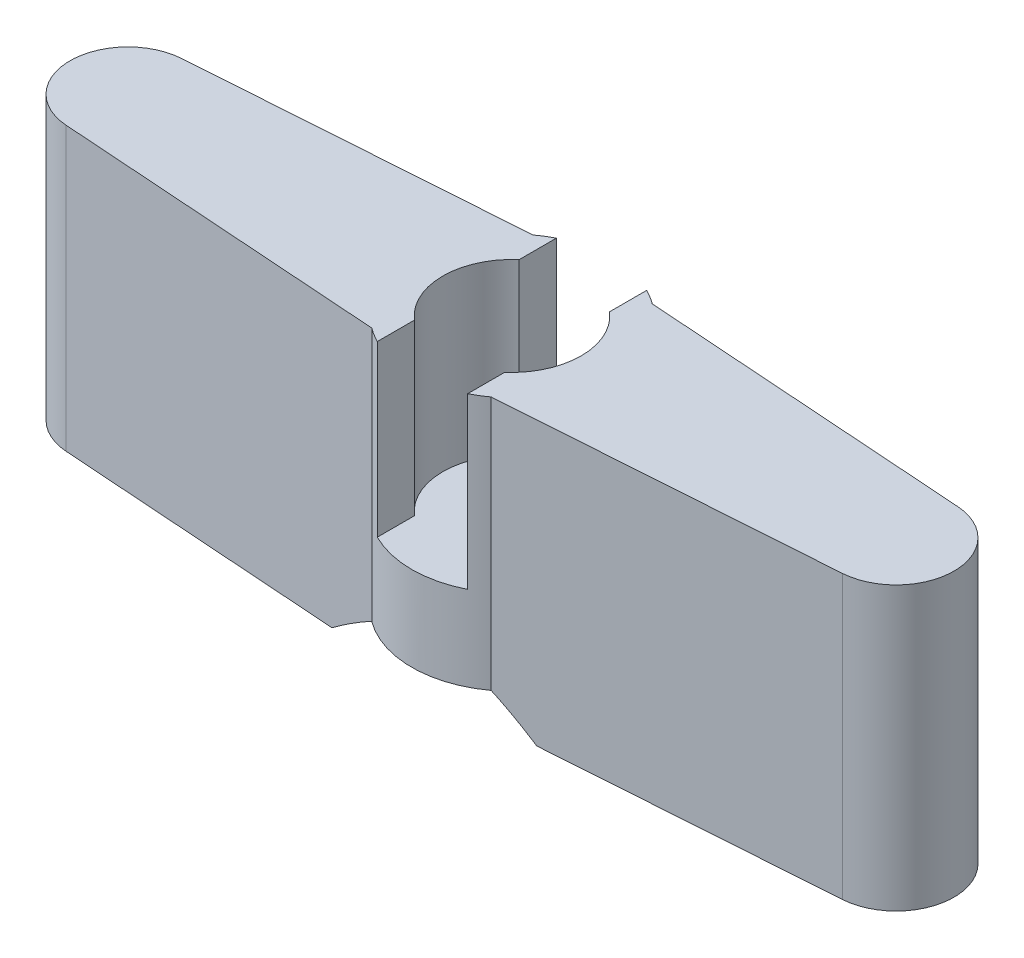
ISO-10303-21;
HEADER;
FILE_DESCRIPTION(('STEP AP214'),'2;1');
FILE_NAME('part.step','',(''),(''),'','','');
FILE_SCHEMA(('AUTOMOTIVE_DESIGN { 1 0 10303 214 1 1 1 1 }'));
ENDSEC;
DATA;
#1=APPLICATION_CONTEXT('core data for automotive mechanical design processes');
#2=APPLICATION_PROTOCOL_DEFINITION('international standard','automotive_design',2000,#1);
#3=PRODUCT_CONTEXT('',#1,'mechanical');
#4=PRODUCT('Part','Part','',(#3));
#5=PRODUCT_RELATED_PRODUCT_CATEGORY('part','',(#4));
#6=PRODUCT_DEFINITION_FORMATION('','',#4);
#7=PRODUCT_DEFINITION_CONTEXT('part definition',#1,'design');
#8=PRODUCT_DEFINITION('design','',#6,#7);
#9=PRODUCT_DEFINITION_SHAPE('','',#8);
#10=(LENGTH_UNIT() NAMED_UNIT(*) SI_UNIT(.MILLI.,.METRE.));
#11=(NAMED_UNIT(*) PLANE_ANGLE_UNIT() SI_UNIT($,.RADIAN.));
#12=(NAMED_UNIT(*) SI_UNIT($,.STERADIAN.) SOLID_ANGLE_UNIT());
#13=UNCERTAINTY_MEASURE_WITH_UNIT(LENGTH_MEASURE(1.E-05),#10,'distance_accuracy_value','');
#14=(GEOMETRIC_REPRESENTATION_CONTEXT(3) GLOBAL_UNCERTAINTY_ASSIGNED_CONTEXT((#13)) GLOBAL_UNIT_ASSIGNED_CONTEXT((#10,
#11,#12)) REPRESENTATION_CONTEXT('',''));
#15=CARTESIAN_POINT('',(0.,0.,0.));
#16=DIRECTION('',(0.,0.,1.));
#17=DIRECTION('',(1.,0.,0.));
#18=AXIS2_PLACEMENT_3D('',#15,#16,#17);
#19=CARTESIAN_POINT('',(-13.6,10.,0.));
#20=DIRECTION('',(0.,-1.,0.));
#21=DIRECTION('',(0.,0.,-1.));
#22=AXIS2_PLACEMENT_3D('',#19,#20,#21);
#23=PLANE('',#22);
#24=CARTESIAN_POINT('',(0.,10.,0.));
#25=DIRECTION('',(0.,1.,0.));
#26=DIRECTION('',(0.,0.,1.));
#27=AXIS2_PLACEMENT_3D('',#24,#25,#26);
#28=CIRCLE('',#27,3.55);
#29=CARTESIAN_POINT('',(-2.11206720067856,10.,2.85336155084101));
#30=VERTEX_POINT('',#29);
#31=CARTESIAN_POINT('',(-1.6,10.,3.16899037549817));
#32=VERTEX_POINT('',#31);
#33=EDGE_CURVE('E267',#30,#32,#28,.T.);
#34=ORIENTED_EDGE('',*,*,#33,.T.);
#35=DIRECTION('',(0.,0.,1.));
#36=VECTOR('',#35,1.);
#37=CARTESIAN_POINT('',(-1.6,10.,5.45));
#38=LINE('',#37,#36);
#39=CARTESIAN_POINT('',(-1.6,10.,1.85539753152795));
#40=VERTEX_POINT('',#39);
#41=EDGE_CURVE('E199',#40,#32,#38,.T.);
#42=ORIENTED_EDGE('',*,*,#41,.F.);
#43=CARTESIAN_POINT('',(0.,10.,0.));
#44=DIRECTION('',(0.,1.,0.));
#45=DIRECTION('',(0.,0.,1.));
#46=AXIS2_PLACEMENT_3D('',#43,#44,#45);
#47=CIRCLE('',#46,2.45);
#48=CARTESIAN_POINT('',(-1.6,10.,-1.85539753152795));
#49=VERTEX_POINT('',#48);
#50=EDGE_CURVE('E202',#49,#40,#47,.T.);
#51=ORIENTED_EDGE('',*,*,#50,.F.);
#52=DIRECTION('',(0.,0.,-1.));
#53=VECTOR('',#52,1.);
#54=CARTESIAN_POINT('',(-1.6,10.,0.));
#55=LINE('',#54,#53);
#56=CARTESIAN_POINT('',(-1.6,10.,-3.16899037549816));
#57=VERTEX_POINT('',#56);
#58=EDGE_CURVE('E58',#49,#57,#55,.T.);
#59=ORIENTED_EDGE('',*,*,#58,.T.);
#60=CARTESIAN_POINT('',(0.,10.,0.));
#61=DIRECTION('',(0.,1.,0.));
#62=DIRECTION('',(0.,0.,1.));
#63=AXIS2_PLACEMENT_3D('',#60,#61,#62);
#64=CIRCLE('',#63,3.55);
#65=CARTESIAN_POINT('',(-2.11206720067856,10.,-2.85336155084101));
#66=VERTEX_POINT('',#65);
#67=EDGE_CURVE('E280',#57,#66,#64,.T.);
#68=ORIENTED_EDGE('',*,*,#67,.T.);
#69=DIRECTION('',(-0.997593558445748,0.,0.0693331965767428));
#70=VECTOR('',#69,1.);
#71=CARTESIAN_POINT('',(-13.7421330529823,10.,-2.04506679481378));
#72=LINE('',#71,#70);
#73=CARTESIAN_POINT('',(-13.7421330529823,10.,-2.04506679481378));
#74=VERTEX_POINT('',#73);
#75=EDGE_CURVE('E285',#66,#74,#72,.T.);
#76=ORIENTED_EDGE('',*,*,#75,.T.);
#77=CARTESIAN_POINT('',(-13.6,10.,0.));
#78=DIRECTION('',(0.,1.,0.));
#79=DIRECTION('',(0.,0.,-1.));
#80=AXIS2_PLACEMENT_3D('',#77,#78,#79);
#81=CIRCLE('',#80,2.05);
#82=CARTESIAN_POINT('',(-13.7421330529823,10.,2.04506679481379));
#83=VERTEX_POINT('',#82);
#84=EDGE_CURVE('E258',#74,#83,#81,.T.);
#85=ORIENTED_EDGE('',*,*,#84,.T.);
#86=DIRECTION('',(0.997593558445748,0.,0.0693331965767427));
#87=VECTOR('',#86,1.);
#88=CARTESIAN_POINT('',(-13.7421330529823,10.,2.04506679481379));
#89=LINE('',#88,#87);
#90=EDGE_CURVE('E262',#83,#30,#89,.T.);
#91=ORIENTED_EDGE('',*,*,#90,.T.);
#92=EDGE_LOOP('',(#34,#42,#51,#59,#68,#76,#85,#91));
#93=FACE_BOUND('',#92,.T.);
#94=ADVANCED_FACE('F47',(#93),#23,.F.);
#95=CARTESIAN_POINT('',(0.,10.,0.));
#96=DIRECTION('',(0.,-1.,0.));
#97=DIRECTION('',(0.,0.,-1.));
#98=AXIS2_PLACEMENT_3D('',#95,#96,#97);
#99=CYLINDRICAL_SURFACE('',#98,3.55);
#100=CARTESIAN_POINT('',(1.6,10.,3.16899037549817));
#101=VERTEX_POINT('',#100);
#102=CARTESIAN_POINT('',(2.11206720067856,10.,2.85336155084101));
#103=VERTEX_POINT('',#102);
#104=EDGE_CURVE('E266',#101,#103,#28,.T.);
#105=ORIENTED_EDGE('',*,*,#104,.F.);
#106=DIRECTION('',(0.,-1.,0.));
#107=VECTOR('',#106,1.);
#108=CARTESIAN_POINT('',(1.6,10.,3.16899037549817));
#109=LINE('',#108,#107);
#110=CARTESIAN_POINT('',(1.6,4.,3.16899037549817));
#111=VERTEX_POINT('',#110);
#112=EDGE_CURVE('E244',#101,#111,#109,.T.);
#113=ORIENTED_EDGE('',*,*,#112,.T.);
#114=CARTESIAN_POINT('',(0.,4.,0.));
#115=DIRECTION('',(0.,1.,0.));
#116=DIRECTION('',(0.,0.,1.));
#117=AXIS2_PLACEMENT_3D('',#114,#115,#116);
#118=CIRCLE('',#117,3.55);
#119=CARTESIAN_POINT('',(-1.6,4.,3.16899037549817));
#120=VERTEX_POINT('',#119);
#121=EDGE_CURVE('E248',#120,#111,#118,.T.);
#122=ORIENTED_EDGE('',*,*,#121,.F.);
#123=DIRECTION('',(0.,-1.,0.));
#124=VECTOR('',#123,1.);
#125=CARTESIAN_POINT('',(-1.6,10.,3.16899037549817));
#126=LINE('',#125,#124);
#127=EDGE_CURVE('E240',#120,#32,#126,.F.);
#128=ORIENTED_EDGE('',*,*,#127,.T.);
#129=ORIENTED_EDGE('',*,*,#33,.F.);
#130=DIRECTION('',(0.,-1.,0.));
#131=VECTOR('',#130,1.);
#132=CARTESIAN_POINT('',(-2.11206720067856,10.,2.85336155084101));
#133=LINE('',#132,#131);
#134=CARTESIAN_POINT('',(-2.11206720067856,1.,2.85336155084101));
#135=VERTEX_POINT('',#134);
#136=EDGE_CURVE('E330',#30,#135,#133,.T.);
#137=ORIENTED_EDGE('',*,*,#136,.T.);
#138=CARTESIAN_POINT('',(0.,1.,0.));
#139=DIRECTION('',(0.,-1.,0.));
#140=DIRECTION('',(0.,0.,-1.));
#141=AXIS2_PLACEMENT_3D('',#138,#139,#140);
#142=CIRCLE('',#141,3.55);
#143=CARTESIAN_POINT('',(2.11206720067856,1.,2.85336155084101));
#144=VERTEX_POINT('',#143);
#145=EDGE_CURVE('E257',#144,#135,#142,.T.);
#146=ORIENTED_EDGE('',*,*,#145,.F.);
#147=DIRECTION('',(0.,-1.,0.));
#148=VECTOR('',#147,1.);
#149=CARTESIAN_POINT('',(2.11206720067856,10.,2.85336155084101));
#150=LINE('',#149,#148);
#151=EDGE_CURVE('E326',#103,#144,#150,.T.);
#152=ORIENTED_EDGE('',*,*,#151,.F.);
#153=EDGE_LOOP('',(#105,#113,#122,#128,#129,#137,#146,#152));
#154=FACE_BOUND('',#153,.T.);
#155=ADVANCED_FACE('F361',(#154),#99,.T.);
#156=CARTESIAN_POINT('',(0.,10.,0.));
#157=DIRECTION('',(0.,-1.,0.));
#158=DIRECTION('',(0.,0.,-1.));
#159=AXIS2_PLACEMENT_3D('',#156,#157,#158);
#160=CYLINDRICAL_SURFACE('',#159,3.55);
#161=ORIENTED_EDGE('',*,*,#67,.F.);
#162=DIRECTION('',(0.,-1.,0.));
#163=VECTOR('',#162,1.);
#164=CARTESIAN_POINT('',(-1.6,10.,-3.16899037549816));
#165=LINE('',#164,#163);
#166=CARTESIAN_POINT('',(-1.6,4.,-3.16899037549816));
#167=VERTEX_POINT('',#166);
#168=EDGE_CURVE('E236',#57,#167,#165,.T.);
#169=ORIENTED_EDGE('',*,*,#168,.T.);
#170=CARTESIAN_POINT('',(0.,4.,0.));
#171=DIRECTION('',(0.,1.,0.));
#172=DIRECTION('',(0.,0.,1.));
#173=AXIS2_PLACEMENT_3D('',#170,#171,#172);
#174=CIRCLE('',#173,3.55);
#175=CARTESIAN_POINT('',(1.6,4.,-3.16899037549817));
#176=VERTEX_POINT('',#175);
#177=EDGE_CURVE('E11',#176,#167,#174,.T.);
#178=ORIENTED_EDGE('',*,*,#177,.F.);
#179=DIRECTION('',(0.,-1.,0.));
#180=VECTOR('',#179,1.);
#181=CARTESIAN_POINT('',(1.6,10.,-3.16899037549817));
#182=LINE('',#181,#180);
#183=CARTESIAN_POINT('',(1.6,10.,-3.16899037549817));
#184=VERTEX_POINT('',#183);
#185=EDGE_CURVE('E189',#176,#184,#182,.F.);
#186=ORIENTED_EDGE('',*,*,#185,.T.);
#187=CARTESIAN_POINT('',(2.11206720067856,10.,-2.85336155084101));
#188=VERTEX_POINT('',#187);
#189=EDGE_CURVE('E281',#188,#184,#64,.T.);
#190=ORIENTED_EDGE('',*,*,#189,.F.);
#191=DIRECTION('',(0.,-1.,0.));
#192=VECTOR('',#191,1.);
#193=CARTESIAN_POINT('',(2.11206720067856,10.,-2.85336155084101));
#194=LINE('',#193,#192);
#195=CARTESIAN_POINT('',(2.11206720067856,1.,-2.85336155084101));
#196=VERTEX_POINT('',#195);
#197=EDGE_CURVE('E314',#188,#196,#194,.T.);
#198=ORIENTED_EDGE('',*,*,#197,.T.);
#199=CARTESIAN_POINT('',(-2.11206720067857,1.,-2.85336155084101));
#200=VERTEX_POINT('',#199);
#201=EDGE_CURVE('E251',#200,#196,#142,.T.);
#202=ORIENTED_EDGE('',*,*,#201,.F.);
#203=DIRECTION('',(0.,-1.,0.));
#204=VECTOR('',#203,1.);
#205=CARTESIAN_POINT('',(-2.11206720067856,10.,-2.85336155084101));
#206=LINE('',#205,#204);
#207=EDGE_CURVE('E310',#66,#200,#206,.T.);
#208=ORIENTED_EDGE('',*,*,#207,.F.);
#209=EDGE_LOOP('',(#161,#169,#178,#186,#190,#198,#202,#208));
#210=FACE_BOUND('',#209,.T.);
#211=ADVANCED_FACE('F364',(#210),#160,.T.);
#212=CARTESIAN_POINT('',(-13.6,0.,0.));
#213=DIRECTION('',(0.,-1.,0.));
#214=DIRECTION('',(0.,0.,-1.));
#215=AXIS2_PLACEMENT_3D('',#212,#213,#214);
#216=PLANE('',#215);
#217=DIRECTION('',(0.997593558445748,0.,-0.0693331965767425));
#218=VECTOR('',#217,1.);
#219=CARTESIAN_POINT('',(13.7421330529823,0.,2.04506679481379));
#220=LINE('',#219,#218);
#221=CARTESIAN_POINT('',(3.62634009064976,0.,2.74811891062712));
#222=VERTEX_POINT('',#221);
#223=CARTESIAN_POINT('',(13.7421330529823,0.,2.04506679481379));
#224=VERTEX_POINT('',#223);
#225=EDGE_CURVE('E295',#222,#224,#220,.T.);
#226=ORIENTED_EDGE('',*,*,#225,.F.);
#227=CARTESIAN_POINT('',(0.,0.,0.));
#228=DIRECTION('',(0.,-1.,0.));
#229=DIRECTION('',(0.,0.,-1.));
#230=AXIS2_PLACEMENT_3D('',#227,#228,#229);
#231=CIRCLE('',#230,4.55000000000001);
#232=CARTESIAN_POINT('',(3.62634009064976,0.,-2.74811891062712));
#233=VERTEX_POINT('',#232);
#234=EDGE_CURVE('E346',#222,#233,#231,.F.);
#235=ORIENTED_EDGE('',*,*,#234,.T.);
#236=DIRECTION('',(-0.997593558445748,0.,-0.0693331965767422));
#237=VECTOR('',#236,1.);
#238=CARTESIAN_POINT('',(13.7421330529823,0.,-2.04506679481379));
#239=LINE('',#238,#237);
#240=CARTESIAN_POINT('',(13.7421330529823,0.,-2.04506679481379));
#241=VERTEX_POINT('',#240);
#242=EDGE_CURVE('E301',#241,#233,#239,.T.);
#243=ORIENTED_EDGE('',*,*,#242,.F.);
#244=CARTESIAN_POINT('',(13.6,0.,0.));
#245=DIRECTION('',(0.,1.,0.));
#246=DIRECTION('',(0.,0.,1.));
#247=AXIS2_PLACEMENT_3D('',#244,#245,#246);
#248=CIRCLE('',#247,2.05000000000001);
#249=EDGE_CURVE('E298',#224,#241,#248,.T.);
#250=ORIENTED_EDGE('',*,*,#249,.F.);
#251=EDGE_LOOP('',(#226,#235,#243,#250));
#252=FACE_BOUND('',#251,.T.);
#253=ADVANCED_FACE('F423',(#252),#216,.T.);
#254=CARTESIAN_POINT('',(-13.6,10.,0.));
#255=DIRECTION('',(0.,-1.,0.));
#256=DIRECTION('',(0.,0.,-1.));
#257=AXIS2_PLACEMENT_3D('',#254,#255,#256);
#258=CYLINDRICAL_SURFACE('',#257,2.05);
#259=CARTESIAN_POINT('',(-13.6,0.,0.));
#260=DIRECTION('',(0.,1.,0.));
#261=DIRECTION('',(0.,0.,-1.));
#262=AXIS2_PLACEMENT_3D('',#259,#260,#261);
#263=CIRCLE('',#262,2.05);
#264=CARTESIAN_POINT('',(-13.7421330529823,0.,-2.04506679481378));
#265=VERTEX_POINT('',#264);
#266=CARTESIAN_POINT('',(-13.7421330529823,0.,2.04506679481379));
#267=VERTEX_POINT('',#266);
#268=EDGE_CURVE('E256',#265,#267,#263,.T.);
#269=ORIENTED_EDGE('',*,*,#268,.T.);
#270=DIRECTION('',(0.,-1.,0.));
#271=VECTOR('',#270,1.);
#272=CARTESIAN_POINT('',(-13.7421330529823,10.,2.04506679481379));
#273=LINE('',#272,#271);
#274=EDGE_CURVE('E334',#83,#267,#273,.T.);
#275=ORIENTED_EDGE('',*,*,#274,.F.);
#276=ORIENTED_EDGE('',*,*,#84,.F.);
#277=DIRECTION('',(0.,-1.,0.));
#278=VECTOR('',#277,1.);
#279=CARTESIAN_POINT('',(-13.7421330529823,10.,-2.04506679481378));
#280=LINE('',#279,#278);
#281=EDGE_CURVE('E288',#74,#265,#280,.T.);
#282=ORIENTED_EDGE('',*,*,#281,.T.);
#283=EDGE_LOOP('',(#269,#275,#276,#282));
#284=FACE_BOUND('',#283,.T.);
#285=ADVANCED_FACE('F368',(#284),#258,.T.);
#286=CARTESIAN_POINT('',(-13.7421330529823,10.,2.04506679481379));
#287=DIRECTION('',(0.0693331965767427,0.,-0.997593558445748));
#288=DIRECTION('',(-0.997593558445748,0.,-0.0693331965767427));
#289=AXIS2_PLACEMENT_3D('',#286,#287,#288);
#290=PLANE('',#289);
#291=DIRECTION('',(0.997593558445748,0.,0.0693331965767427));
#292=VECTOR('',#291,1.);
#293=CARTESIAN_POINT('',(-13.7421330529823,0.,2.04506679481379));
#294=LINE('',#293,#292);
#295=CARTESIAN_POINT('',(-3.62634009064976,0.,2.74811891062712));
#296=VERTEX_POINT('',#295);
#297=EDGE_CURVE('E292',#267,#296,#294,.T.);
#298=ORIENTED_EDGE('',*,*,#297,.T.);
#299=CARTESIAN_POINT('',(-3.62634009064976,0.,2.74811891062712));
#300=CARTESIAN_POINT('',(-3.56590848595752,0.045624601248627,2.75231893406562));
#301=CARTESIAN_POINT('',(-3.5052283571652,0.0909188225686992,2.75653623003976));
#302=CARTESIAN_POINT('',(-3.38330868891469,0.180751091504821,2.76500970127844));
#303=CARTESIAN_POINT('',(-3.32206911854095,0.225289096937731,2.76926587869163));
#304=CARTESIAN_POINT('',(-3.13760331436292,0.357492306941444,2.78208633423135));
#305=CARTESIAN_POINT('',(-3.01345798646107,0.443877369671635,2.79071448980697));
#306=CARTESIAN_POINT('',(-2.76208590967858,0.612206771574467,2.80818496108849));
#307=CARTESIAN_POINT('',(-2.63485759591579,0.694148784178086,2.81702738555441));
#308=CARTESIAN_POINT('',(-2.44116362123405,0.812578086557585,2.83048920305378));
#309=CARTESIAN_POINT('',(-2.37607772070416,0.851332476561334,2.83501270212573));
#310=CARTESIAN_POINT('',(-2.24487074993972,0.92706624456065,2.8441316450251));
#311=CARTESIAN_POINT('',(-2.17874948073959,0.96404527569555,2.84872710268072));
#312=CARTESIAN_POINT('',(-2.11206720067856,0.999999999999999,2.85336155084101));
#313=B_SPLINE_CURVE_WITH_KNOTS('',3,(#299,#300,#301,#302,#303,#304,#305,#306,#307,#308,#309,
#310,#311,#312),.UNSPECIFIED.,.F.,.F.,(4,2,2,2,2,2,4),(0.,0.2275090264457,0.455030702351731,
0.909425258386063,1.36405550123759,1.59168562674736,1.8193600459938),.UNSPECIFIED.);
#314=EDGE_CURVE('E371',#296,#135,#313,.T.);
#315=ORIENTED_EDGE('',*,*,#314,.T.);
#316=ORIENTED_EDGE('',*,*,#136,.F.);
#317=ORIENTED_EDGE('',*,*,#90,.F.);
#318=ORIENTED_EDGE('',*,*,#274,.T.);
#319=EDGE_LOOP('',(#298,#315,#316,#317,#318));
#320=FACE_BOUND('',#319,.T.);
#321=ADVANCED_FACE('F358',(#320),#290,.F.);
#322=CARTESIAN_POINT('',(13.7421330529823,10.,2.04506679481379));
#323=DIRECTION('',(-0.0693331965767425,0.,-0.997593558445748));
#324=DIRECTION('',(-0.997593558445748,0.,0.0693331965767425));
#325=AXIS2_PLACEMENT_3D('',#322,#323,#324);
#326=PLANE('',#325);
#327=ORIENTED_EDGE('',*,*,#151,.T.);
#328=CARTESIAN_POINT('',(2.11206720067856,1.,2.85336155084101));
#329=CARTESIAN_POINT('',(2.17874948073959,0.96404527569555,2.84872710268072));
#330=CARTESIAN_POINT('',(2.24487074993972,0.92706624456065,2.8441316450251));
#331=CARTESIAN_POINT('',(2.37607772070416,0.851332476561335,2.83501270212573));
#332=CARTESIAN_POINT('',(2.44116362123405,0.812578086557586,2.83048920305378));
#333=CARTESIAN_POINT('',(2.63485759591579,0.694148784178086,2.81702738555441));
#334=CARTESIAN_POINT('',(2.76208590967858,0.612206771574467,2.80818496108849));
#335=CARTESIAN_POINT('',(3.01345798646107,0.443877369671635,2.79071448980697));
#336=CARTESIAN_POINT('',(3.13760331436292,0.357492306941445,2.78208633423135));
#337=CARTESIAN_POINT('',(3.32206911854095,0.225289096937731,2.76926587869163));
#338=CARTESIAN_POINT('',(3.38330868891469,0.180751091504821,2.76500970127844));
#339=CARTESIAN_POINT('',(3.5052283571652,0.0909188225686992,2.75653623003976));
#340=CARTESIAN_POINT('',(3.56590848595752,0.0456246012486269,2.75231893406562));
#341=CARTESIAN_POINT('',(3.62634009064976,0.,2.74811891062712));
#342=B_SPLINE_CURVE_WITH_KNOTS('',3,(#328,#329,#330,#331,#332,#333,#334,#335,#336,#337,#338,
#339,#340,#341),.UNSPECIFIED.,.F.,.F.,(4,2,2,2,2,2,4),(0.,0.227674419246436,0.455304544756207,
0.909934787607735,1.36432934364207,1.5918510195481,1.8193600459938),.UNSPECIFIED.);
#343=EDGE_CURVE('E338',#144,#222,#342,.T.);
#344=ORIENTED_EDGE('',*,*,#343,.T.);
#345=ORIENTED_EDGE('',*,*,#225,.T.);
#346=DIRECTION('',(0.,-1.,0.));
#347=VECTOR('',#346,1.);
#348=CARTESIAN_POINT('',(13.7421330529823,10.,2.04506679481379));
#349=LINE('',#348,#347);
#350=CARTESIAN_POINT('',(13.7421330529823,10.,2.04506679481379));
#351=VERTEX_POINT('',#350);
#352=EDGE_CURVE('E322',#351,#224,#349,.T.);
#353=ORIENTED_EDGE('',*,*,#352,.F.);
#354=DIRECTION('',(0.997593558445748,0.,-0.0693331965767425));
#355=VECTOR('',#354,1.);
#356=CARTESIAN_POINT('',(13.7421330529823,10.,2.04506679481379));
#357=LINE('',#356,#355);
#358=EDGE_CURVE('E271',#103,#351,#357,.T.);
#359=ORIENTED_EDGE('',*,*,#358,.F.);
#360=EDGE_LOOP('',(#327,#344,#345,#353,#359));
#361=FACE_BOUND('',#360,.T.);
#362=ADVANCED_FACE('F352',(#361),#326,.F.);
#363=CARTESIAN_POINT('',(13.6,10.,0.));
#364=DIRECTION('',(0.,-1.,0.));
#365=DIRECTION('',(0.,0.,-1.));
#366=AXIS2_PLACEMENT_3D('',#363,#364,#365);
#367=CYLINDRICAL_SURFACE('',#366,2.05000000000001);
#368=ORIENTED_EDGE('',*,*,#249,.T.);
#369=DIRECTION('',(0.,-1.,0.));
#370=VECTOR('',#369,1.);
#371=CARTESIAN_POINT('',(13.7421330529823,10.,-2.04506679481379));
#372=LINE('',#371,#370);
#373=CARTESIAN_POINT('',(13.7421330529823,10.,-2.04506679481379));
#374=VERTEX_POINT('',#373);
#375=EDGE_CURVE('E318',#374,#241,#372,.T.);
#376=ORIENTED_EDGE('',*,*,#375,.F.);
#377=CARTESIAN_POINT('',(13.6,10.,0.));
#378=DIRECTION('',(0.,1.,0.));
#379=DIRECTION('',(0.,0.,1.));
#380=AXIS2_PLACEMENT_3D('',#377,#378,#379);
#381=CIRCLE('',#380,2.05000000000001);
#382=EDGE_CURVE('E274',#351,#374,#381,.T.);
#383=ORIENTED_EDGE('',*,*,#382,.F.);
#384=ORIENTED_EDGE('',*,*,#352,.T.);
#385=EDGE_LOOP('',(#368,#376,#383,#384));
#386=FACE_BOUND('',#385,.T.);
#387=ADVANCED_FACE('F357',(#386),#367,.T.);
#388=CARTESIAN_POINT('',(13.7421330529823,10.,-2.04506679481379));
#389=DIRECTION('',(-0.0693331965767422,0.,0.997593558445748));
#390=DIRECTION('',(0.997593558445749,0.,0.0693331965767422));
#391=AXIS2_PLACEMENT_3D('',#388,#389,#390);
#392=PLANE('',#391);
#393=ORIENTED_EDGE('',*,*,#242,.T.);
#394=CARTESIAN_POINT('',(3.62634009064976,0.,-2.74811891062712));
#395=CARTESIAN_POINT('',(3.56590848595752,0.0456246012486268,-2.75231893406563));
#396=CARTESIAN_POINT('',(3.5052283571652,0.0909188225686991,-2.75653623003976));
#397=CARTESIAN_POINT('',(3.38330868891469,0.180751091504821,-2.76500970127844));
#398=CARTESIAN_POINT('',(3.32206911854095,0.225289096937732,-2.76926587869163));
#399=CARTESIAN_POINT('',(3.13760331436292,0.357492306941445,-2.78208633423135));
#400=CARTESIAN_POINT('',(3.01345798646107,0.443877369671636,-2.79071448980697));
#401=CARTESIAN_POINT('',(2.76208590967858,0.612206771574468,-2.80818496108849));
#402=CARTESIAN_POINT('',(2.63485759591579,0.694148784178087,-2.81702738555441));
#403=CARTESIAN_POINT('',(2.44116362123405,0.812578086557586,-2.83048920305378));
#404=CARTESIAN_POINT('',(2.37607772070416,0.851332476561335,-2.83501270212573));
#405=CARTESIAN_POINT('',(2.24487074993972,0.927066244560651,-2.8441316450251));
#406=CARTESIAN_POINT('',(2.17874948073959,0.964045275695551,-2.84872710268072));
#407=CARTESIAN_POINT('',(2.11206720067856,1.,-2.85336155084101));
#408=B_SPLINE_CURVE_WITH_KNOTS('',3,(#394,#395,#396,#397,#398,#399,#400,#401,#402,#403,#404,
#405,#406,#407),.UNSPECIFIED.,.F.,.F.,(4,2,2,2,2,2,4),(0.,0.2275090264457,0.455030702351732,
0.909425258386064,1.36405550123759,1.59168562674736,1.8193600459938),.UNSPECIFIED.);
#409=EDGE_CURVE('E416',#233,#196,#408,.T.);
#410=ORIENTED_EDGE('',*,*,#409,.T.);
#411=ORIENTED_EDGE('',*,*,#197,.F.);
#412=DIRECTION('',(-0.997593558445748,0.,-0.0693331965767422));
#413=VECTOR('',#412,1.);
#414=CARTESIAN_POINT('',(13.7421330529823,10.,-2.04506679481379));
#415=LINE('',#414,#413);
#416=EDGE_CURVE('E277',#374,#188,#415,.T.);
#417=ORIENTED_EDGE('',*,*,#416,.F.);
#418=ORIENTED_EDGE('',*,*,#375,.T.);
#419=EDGE_LOOP('',(#393,#410,#411,#417,#418));
#420=FACE_BOUND('',#419,.T.);
#421=ADVANCED_FACE('F428',(#420),#392,.F.);
#422=CARTESIAN_POINT('',(-13.7421330529823,10.,-2.04506679481378));
#423=DIRECTION('',(0.0693331965767428,0.,0.997593558445748));
#424=DIRECTION('',(0.997593558445748,0.,-0.0693331965767428));
#425=AXIS2_PLACEMENT_3D('',#422,#423,#424);
#426=PLANE('',#425);
#427=ORIENTED_EDGE('',*,*,#207,.T.);
#428=CARTESIAN_POINT('',(-2.11206720067856,1.,-2.85336155084101));
#429=CARTESIAN_POINT('',(-2.17874948073959,0.964045275695551,-2.84872710268072));
#430=CARTESIAN_POINT('',(-2.24487074993972,0.927066244560651,-2.8441316450251));
#431=CARTESIAN_POINT('',(-2.37607772070416,0.851332476561335,-2.83501270212573));
#432=CARTESIAN_POINT('',(-2.44116362123405,0.812578086557586,-2.83048920305378));
#433=CARTESIAN_POINT('',(-2.63485759591579,0.694148784178086,-2.81702738555441));
#434=CARTESIAN_POINT('',(-2.76208590967859,0.612206771574467,-2.80818496108849));
#435=CARTESIAN_POINT('',(-3.01345798646107,0.443877369671635,-2.79071448980696));
#436=CARTESIAN_POINT('',(-3.13760331436292,0.357492306941445,-2.78208633423135));
#437=CARTESIAN_POINT('',(-3.32206911854096,0.225289096937731,-2.76926587869163));
#438=CARTESIAN_POINT('',(-3.3833086889147,0.180751091504821,-2.76500970127844));
#439=CARTESIAN_POINT('',(-3.50522835716521,0.0909188225686987,-2.75653623003976));
#440=CARTESIAN_POINT('',(-3.56590848595752,0.0456246012486266,-2.75231893406562));
#441=CARTESIAN_POINT('',(-3.62634009064976,0.,-2.74811891062712));
#442=B_SPLINE_CURVE_WITH_KNOTS('',3,(#428,#429,#430,#431,#432,#433,#434,#435,#436,#437,#438,
#439,#440,#441),.UNSPECIFIED.,.F.,.F.,(4,2,2,2,2,2,4),(0.,0.227674419246436,0.455304544756208,
0.909934787607736,1.36432934364207,1.5918510195481,1.8193600459938),.UNSPECIFIED.);
#443=CARTESIAN_POINT('',(-3.62634009064976,0.,-2.74811891062712));
#444=VERTEX_POINT('',#443);
#445=EDGE_CURVE('E436',#200,#444,#442,.T.);
#446=ORIENTED_EDGE('',*,*,#445,.T.);
#447=DIRECTION('',(-0.997593558445748,0.,0.0693331965767428));
#448=VECTOR('',#447,1.);
#449=CARTESIAN_POINT('',(-13.7421330529823,0.,-2.04506679481378));
#450=LINE('',#449,#448);
#451=EDGE_CURVE('E263',#444,#265,#450,.T.);
#452=ORIENTED_EDGE('',*,*,#451,.T.);
#453=ORIENTED_EDGE('',*,*,#281,.F.);
#454=ORIENTED_EDGE('',*,*,#75,.F.);
#455=EDGE_LOOP('',(#427,#446,#452,#453,#454));
#456=FACE_BOUND('',#455,.T.);
#457=ADVANCED_FACE('F450',(#456),#426,.F.);
#458=CARTESIAN_POINT('',(0.,10.,0.));
#459=DIRECTION('',(0.,1.,0.));
#460=DIRECTION('',(0.,0.,1.));
#461=AXIS2_PLACEMENT_3D('',#458,#459,#460);
#462=CIRCLE('',#461,2.45);
#463=CARTESIAN_POINT('',(1.6,10.,1.85539753152795));
#464=VERTEX_POINT('',#463);
#465=CARTESIAN_POINT('',(1.6,10.,-1.85539753152795));
#466=VERTEX_POINT('',#465);
#467=EDGE_CURVE('E65',#464,#466,#462,.T.);
#468=ORIENTED_EDGE('',*,*,#467,.F.);
#469=DIRECTION('',(0.,0.,1.));
#470=VECTOR('',#469,1.);
#471=CARTESIAN_POINT('',(1.6,10.,0.));
#472=LINE('',#471,#470);
#473=EDGE_CURVE('E379',#464,#101,#472,.T.);
#474=ORIENTED_EDGE('',*,*,#473,.T.);
#475=ORIENTED_EDGE('',*,*,#104,.T.);
#476=ORIENTED_EDGE('',*,*,#358,.T.);
#477=ORIENTED_EDGE('',*,*,#382,.T.);
#478=ORIENTED_EDGE('',*,*,#416,.T.);
#479=ORIENTED_EDGE('',*,*,#189,.T.);
#480=DIRECTION('',(0.,0.,-1.));
#481=VECTOR('',#480,1.);
#482=CARTESIAN_POINT('',(1.6,10.,-1.85539753152795));
#483=LINE('',#482,#481);
#484=EDGE_CURVE('E219',#466,#184,#483,.T.);
#485=ORIENTED_EDGE('',*,*,#484,.F.);
#486=EDGE_LOOP('',(#468,#474,#475,#476,#477,#478,#479,#485));
#487=FACE_BOUND('',#486,.T.);
#488=ADVANCED_FACE('F430',(#487),#23,.F.);
#489=ORIENTED_EDGE('',*,*,#451,.F.);
#490=CARTESIAN_POINT('',(0.,0.,0.));
#491=DIRECTION('',(0.,-1.,0.));
#492=DIRECTION('',(0.,0.,-1.));
#493=AXIS2_PLACEMENT_3D('',#490,#491,#492);
#494=CIRCLE('',#493,4.55000000000001);
#495=EDGE_CURVE('E73',#444,#296,#494,.F.);
#496=ORIENTED_EDGE('',*,*,#495,.T.);
#497=ORIENTED_EDGE('',*,*,#297,.F.);
#498=ORIENTED_EDGE('',*,*,#268,.F.);
#499=EDGE_LOOP('',(#489,#496,#497,#498));
#500=FACE_BOUND('',#499,.T.);
#501=ADVANCED_FACE('F455',(#500),#216,.T.);
#502=CARTESIAN_POINT('',(0.,1.,0.));
#503=DIRECTION('',(0.,-1.,0.));
#504=DIRECTION('',(0.,0.,-1.));
#505=AXIS2_PLACEMENT_3D('',#502,#503,#504);
#506=PLANE('',#505);
#507=EDGE_CURVE('E252',#196,#144,#142,.T.);
#508=ORIENTED_EDGE('',*,*,#507,.T.);
#509=ORIENTED_EDGE('',*,*,#145,.T.);
#510=EDGE_CURVE('E400',#135,#200,#142,.T.);
#511=ORIENTED_EDGE('',*,*,#510,.T.);
#512=ORIENTED_EDGE('',*,*,#201,.T.);
#513=EDGE_LOOP('',(#508,#509,#511,#512));
#514=FACE_BOUND('',#513,.T.);
#515=ADVANCED_FACE('F405',(#514),#506,.T.);
#516=CARTESIAN_POINT('',(0.,1.,0.));
#517=DIRECTION('',(0.,-1.,0.));
#518=DIRECTION('',(0.,0.,-1.));
#519=AXIS2_PLACEMENT_3D('',#516,#517,#518);
#520=CONICAL_SURFACE('',#519,3.55,0.785398163397452);
#521=ORIENTED_EDGE('',*,*,#409,.F.);
#522=ORIENTED_EDGE('',*,*,#234,.F.);
#523=ORIENTED_EDGE('',*,*,#343,.F.);
#524=ORIENTED_EDGE('',*,*,#507,.F.);
#525=EDGE_LOOP('',(#521,#522,#523,#524));
#526=FACE_BOUND('',#525,.T.);
#527=ADVANCED_FACE('F349',(#526),#520,.F.);
#528=CARTESIAN_POINT('',(0.,1.,0.));
#529=DIRECTION('',(0.,-1.,0.));
#530=DIRECTION('',(0.,0.,-1.));
#531=AXIS2_PLACEMENT_3D('',#528,#529,#530);
#532=CONICAL_SURFACE('',#531,3.55,0.785398163397452);
#533=ORIENTED_EDGE('',*,*,#314,.F.);
#534=ORIENTED_EDGE('',*,*,#495,.F.);
#535=ORIENTED_EDGE('',*,*,#445,.F.);
#536=ORIENTED_EDGE('',*,*,#510,.F.);
#537=EDGE_LOOP('',(#533,#534,#535,#536));
#538=FACE_BOUND('',#537,.T.);
#539=ADVANCED_FACE('F50',(#538),#532,.F.);
#540=CARTESIAN_POINT('',(0.,4.,0.));
#541=DIRECTION('',(0.,1.,0.));
#542=DIRECTION('',(0.,0.,1.));
#543=AXIS2_PLACEMENT_3D('',#540,#541,#542);
#544=PLANE('',#543);
#545=ORIENTED_EDGE('',*,*,#121,.T.);
#546=DIRECTION('',(0.,0.,-1.));
#547=VECTOR('',#546,1.);
#548=CARTESIAN_POINT('',(1.6,4.,1.85539753152795));
#549=LINE('',#548,#547);
#550=CARTESIAN_POINT('',(1.6,4.,1.85539753152795));
#551=VERTEX_POINT('',#550);
#552=EDGE_CURVE('E183',#111,#551,#549,.T.);
#553=ORIENTED_EDGE('',*,*,#552,.T.);
#554=CARTESIAN_POINT('',(0.,4.,0.));
#555=DIRECTION('',(0.,1.,0.));
#556=DIRECTION('',(0.,0.,1.));
#557=AXIS2_PLACEMENT_3D('',#554,#555,#556);
#558=CIRCLE('',#557,2.45);
#559=CARTESIAN_POINT('',(1.6,4.,-1.85539753152795));
#560=VERTEX_POINT('',#559);
#561=EDGE_CURVE('E178',#551,#560,#558,.T.);
#562=ORIENTED_EDGE('',*,*,#561,.T.);
#563=DIRECTION('',(0.,0.,-1.));
#564=VECTOR('',#563,1.);
#565=CARTESIAN_POINT('',(1.6,4.,-1.85539753152795));
#566=LINE('',#565,#564);
#567=EDGE_CURVE('E186',#560,#176,#566,.T.);
#568=ORIENTED_EDGE('',*,*,#567,.T.);
#569=ORIENTED_EDGE('',*,*,#177,.T.);
#570=DIRECTION('',(0.,0.,1.));
#571=VECTOR('',#570,1.);
#572=CARTESIAN_POINT('',(-1.6,4.,-5.45));
#573=LINE('',#572,#571);
#574=CARTESIAN_POINT('',(-1.6,4.,-1.85539753152795));
#575=VERTEX_POINT('',#574);
#576=EDGE_CURVE('E193',#167,#575,#573,.T.);
#577=ORIENTED_EDGE('',*,*,#576,.T.);
#578=CARTESIAN_POINT('',(0.,4.,0.));
#579=DIRECTION('',(0.,1.,0.));
#580=DIRECTION('',(0.,0.,1.));
#581=AXIS2_PLACEMENT_3D('',#578,#579,#580);
#582=CIRCLE('',#581,2.45);
#583=CARTESIAN_POINT('',(-1.6,4.,1.85539753152795));
#584=VERTEX_POINT('',#583);
#585=EDGE_CURVE('E207',#575,#584,#582,.T.);
#586=ORIENTED_EDGE('',*,*,#585,.T.);
#587=DIRECTION('',(0.,0.,1.));
#588=VECTOR('',#587,1.);
#589=CARTESIAN_POINT('',(-1.6,4.,5.45));
#590=LINE('',#589,#588);
#591=EDGE_CURVE('E211',#584,#120,#590,.T.);
#592=ORIENTED_EDGE('',*,*,#591,.T.);
#593=EDGE_LOOP('',(#545,#553,#562,#568,#569,#577,#586,#592));
#594=FACE_BOUND('',#593,.T.);
#595=ADVANCED_FACE('F195',(#594),#544,.T.);
#596=CARTESIAN_POINT('',(1.6,4.,1.85539753152795));
#597=DIRECTION('',(1.,0.,0.));
#598=DIRECTION('',(0.,0.,-1.));
#599=AXIS2_PLACEMENT_3D('',#596,#597,#598);
#600=PLANE('',#599);
#601=ORIENTED_EDGE('',*,*,#473,.F.);
#602=DIRECTION('',(0.,1.,0.));
#603=VECTOR('',#602,1.);
#604=CARTESIAN_POINT('',(1.6,4.,1.85539753152795));
#605=LINE('',#604,#603);
#606=EDGE_CURVE('E225',#551,#464,#605,.T.);
#607=ORIENTED_EDGE('',*,*,#606,.F.);
#608=ORIENTED_EDGE('',*,*,#552,.F.);
#609=ORIENTED_EDGE('',*,*,#112,.F.);
#610=EDGE_LOOP('',(#601,#607,#608,#609));
#611=FACE_BOUND('',#610,.T.);
#612=ADVANCED_FACE('F492',(#611),#600,.F.);
#613=CARTESIAN_POINT('',(-1.6,4.,5.45));
#614=DIRECTION('',(-1.,0.,0.));
#615=DIRECTION('',(0.,0.,1.));
#616=AXIS2_PLACEMENT_3D('',#613,#614,#615);
#617=PLANE('',#616);
#618=ORIENTED_EDGE('',*,*,#591,.F.);
#619=DIRECTION('',(0.,1.,0.));
#620=VECTOR('',#619,1.);
#621=CARTESIAN_POINT('',(-1.6,4.,1.85539753152795));
#622=LINE('',#621,#620);
#623=EDGE_CURVE('E228',#584,#40,#622,.T.);
#624=ORIENTED_EDGE('',*,*,#623,.T.);
#625=ORIENTED_EDGE('',*,*,#41,.T.);
#626=ORIENTED_EDGE('',*,*,#127,.F.);
#627=EDGE_LOOP('',(#618,#624,#625,#626));
#628=FACE_BOUND('',#627,.T.);
#629=ADVANCED_FACE('F489',(#628),#617,.F.);
#630=CARTESIAN_POINT('',(-1.6,4.,-5.45));
#631=DIRECTION('',(-1.,0.,0.));
#632=DIRECTION('',(0.,0.,1.));
#633=AXIS2_PLACEMENT_3D('',#630,#631,#632);
#634=PLANE('',#633);
#635=ORIENTED_EDGE('',*,*,#58,.F.);
#636=DIRECTION('',(0.,1.,0.));
#637=VECTOR('',#636,1.);
#638=CARTESIAN_POINT('',(-1.6,4.,-1.85539753152795));
#639=LINE('',#638,#637);
#640=EDGE_CURVE('E182',#575,#49,#639,.T.);
#641=ORIENTED_EDGE('',*,*,#640,.F.);
#642=ORIENTED_EDGE('',*,*,#576,.F.);
#643=ORIENTED_EDGE('',*,*,#168,.F.);
#644=EDGE_LOOP('',(#635,#641,#642,#643));
#645=FACE_BOUND('',#644,.T.);
#646=ADVANCED_FACE('F494',(#645),#634,.F.);
#647=CARTESIAN_POINT('',(1.6,4.,-1.85539753152795));
#648=DIRECTION('',(1.,0.,0.));
#649=DIRECTION('',(0.,0.,-1.));
#650=AXIS2_PLACEMENT_3D('',#647,#648,#649);
#651=PLANE('',#650);
#652=ORIENTED_EDGE('',*,*,#567,.F.);
#653=DIRECTION('',(0.,1.,0.));
#654=VECTOR('',#653,1.);
#655=CARTESIAN_POINT('',(1.6,4.,-1.85539753152795));
#656=LINE('',#655,#654);
#657=EDGE_CURVE('E174',#560,#466,#656,.T.);
#658=ORIENTED_EDGE('',*,*,#657,.T.);
#659=ORIENTED_EDGE('',*,*,#484,.T.);
#660=ORIENTED_EDGE('',*,*,#185,.F.);
#661=EDGE_LOOP('',(#652,#658,#659,#660));
#662=FACE_BOUND('',#661,.T.);
#663=ADVANCED_FACE('F187',(#662),#651,.F.);
#664=CARTESIAN_POINT('',(0.,4.,0.));
#665=DIRECTION('',(0.,1.,0.));
#666=DIRECTION('',(0.,0.,1.));
#667=AXIS2_PLACEMENT_3D('',#664,#665,#666);
#668=CYLINDRICAL_SURFACE('',#667,2.45);
#669=ORIENTED_EDGE('',*,*,#467,.T.);
#670=ORIENTED_EDGE('',*,*,#657,.F.);
#671=ORIENTED_EDGE('',*,*,#561,.F.);
#672=ORIENTED_EDGE('',*,*,#606,.T.);
#673=EDGE_LOOP('',(#669,#670,#671,#672));
#674=FACE_BOUND('',#673,.T.);
#675=ADVANCED_FACE('F176',(#674),#668,.F.);
#676=CARTESIAN_POINT('',(0.,4.,0.));
#677=DIRECTION('',(0.,1.,0.));
#678=DIRECTION('',(0.,0.,1.));
#679=AXIS2_PLACEMENT_3D('',#676,#677,#678);
#680=CYLINDRICAL_SURFACE('',#679,2.45);
#681=ORIENTED_EDGE('',*,*,#50,.T.);
#682=ORIENTED_EDGE('',*,*,#623,.F.);
#683=ORIENTED_EDGE('',*,*,#585,.F.);
#684=ORIENTED_EDGE('',*,*,#640,.T.);
#685=EDGE_LOOP('',(#681,#682,#683,#684));
#686=FACE_BOUND('',#685,.T.);
#687=ADVANCED_FACE('F497',(#686),#680,.F.);
#688=CLOSED_SHELL('',(#94,#155,#211,#253,#285,#321,#362,#387,#421,#457,#488,#501,#515,#527,#539,
#595,#612,#629,#646,#663,#675,#687));
#689=MANIFOLD_SOLID_BREP('B2',#688);
#690=ADVANCED_BREP_SHAPE_REPRESENTATION('',(#18,#689),#14);
#691=SHAPE_DEFINITION_REPRESENTATION(#9,#690);
ENDSEC;
END-ISO-10303-21;
